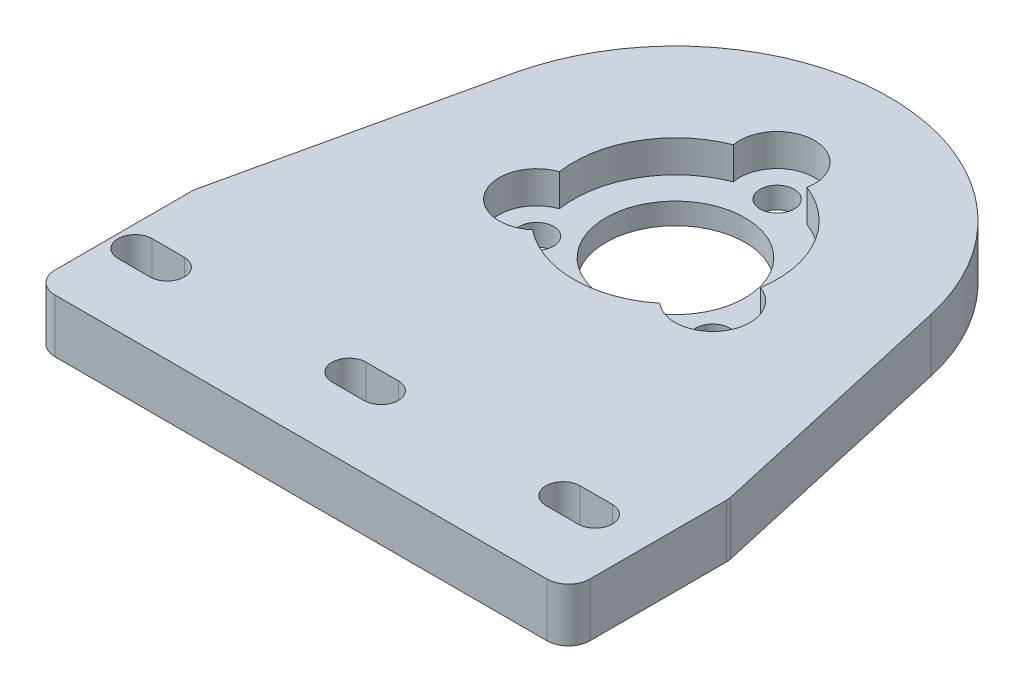
ISO-10303-21;
HEADER;
FILE_DESCRIPTION(('STEP AP214'),'2;1');
FILE_NAME('part.step','',(''),(''),'','','');
FILE_SCHEMA(('AUTOMOTIVE_DESIGN { 1 0 10303 214 1 1 1 1 }'));
ENDSEC;
DATA;
#1=APPLICATION_CONTEXT('core data for automotive mechanical design processes');
#2=APPLICATION_PROTOCOL_DEFINITION('international standard','automotive_design',2000,#1);
#3=PRODUCT_CONTEXT('',#1,'mechanical');
#4=PRODUCT('Part','Part','',(#3));
#5=PRODUCT_RELATED_PRODUCT_CATEGORY('part','',(#4));
#6=PRODUCT_DEFINITION_FORMATION('','',#4);
#7=PRODUCT_DEFINITION_CONTEXT('part definition',#1,'design');
#8=PRODUCT_DEFINITION('design','',#6,#7);
#9=PRODUCT_DEFINITION_SHAPE('','',#8);
#10=(LENGTH_UNIT() NAMED_UNIT(*) SI_UNIT(.MILLI.,.METRE.));
#11=(NAMED_UNIT(*) PLANE_ANGLE_UNIT() SI_UNIT($,.RADIAN.));
#12=(NAMED_UNIT(*) SI_UNIT($,.STERADIAN.) SOLID_ANGLE_UNIT());
#13=UNCERTAINTY_MEASURE_WITH_UNIT(LENGTH_MEASURE(1.E-05),#10,'distance_accuracy_value','');
#14=(GEOMETRIC_REPRESENTATION_CONTEXT(3) GLOBAL_UNCERTAINTY_ASSIGNED_CONTEXT((#13)) GLOBAL_UNIT_ASSIGNED_CONTEXT((#10,
#11,#12)) REPRESENTATION_CONTEXT('',''));
#15=CARTESIAN_POINT('',(0.,0.,0.));
#16=DIRECTION('',(0.,0.,1.));
#17=DIRECTION('',(1.,0.,0.));
#18=AXIS2_PLACEMENT_3D('',#15,#16,#17);
#19=CARTESIAN_POINT('',(0.,5.,0.));
#20=DIRECTION('',(0.,-1.,0.));
#21=DIRECTION('',(0.,0.,-1.));
#22=AXIS2_PLACEMENT_3D('',#19,#20,#21);
#23=CYLINDRICAL_SURFACE('',#22,6.5);
#24=CARTESIAN_POINT('',(0.,0.,0.));
#25=DIRECTION('',(0.,1.,0.));
#26=DIRECTION('',(0.,0.,1.));
#27=AXIS2_PLACEMENT_3D('',#24,#25,#26);
#28=CIRCLE('',#27,6.5);
#29=CARTESIAN_POINT('',(0.,0.,6.5));
#30=VERTEX_POINT('',#29);
#31=EDGE_CURVE('E427',#30,#30,#28,.T.);
#32=ORIENTED_EDGE('',*,*,#31,.F.);
#33=EDGE_LOOP('',(#32));
#34=FACE_BOUND('',#33,.T.);
#35=CARTESIAN_POINT('',(0.,2.,0.));
#36=DIRECTION('',(0.,1.,0.));
#37=DIRECTION('',(0.,0.,1.));
#38=AXIS2_PLACEMENT_3D('',#35,#36,#37);
#39=CIRCLE('',#38,6.5);
#40=CARTESIAN_POINT('',(0.,2.,6.5));
#41=VERTEX_POINT('',#40);
#42=EDGE_CURVE('E377',#41,#41,#39,.F.);
#43=ORIENTED_EDGE('',*,*,#42,.F.);
#44=EDGE_LOOP('',(#43));
#45=FACE_BOUND('',#44,.T.);
#46=ADVANCED_FACE('F82',(#34,#45),#23,.F.);
#47=CARTESIAN_POINT('',(0.,5.,-9.5));
#48=DIRECTION('',(0.,-1.,0.));
#49=DIRECTION('',(0.,0.,-1.));
#50=AXIS2_PLACEMENT_3D('',#47,#48,#49);
#51=CYLINDRICAL_SURFACE('',#50,1.6);
#52=CARTESIAN_POINT('',(0.,0.,-9.5));
#53=DIRECTION('',(0.,1.,0.));
#54=DIRECTION('',(0.,0.,1.));
#55=AXIS2_PLACEMENT_3D('',#52,#53,#54);
#56=CIRCLE('',#55,1.6);
#57=CARTESIAN_POINT('',(0.,0.,-7.9));
#58=VERTEX_POINT('',#57);
#59=EDGE_CURVE('E424',#58,#58,#56,.T.);
#60=ORIENTED_EDGE('',*,*,#59,.F.);
#61=EDGE_LOOP('',(#60));
#62=FACE_BOUND('',#61,.T.);
#63=CARTESIAN_POINT('',(0.,2.,-9.5));
#64=DIRECTION('',(0.,1.,0.));
#65=DIRECTION('',(0.,0.,1.));
#66=AXIS2_PLACEMENT_3D('',#63,#64,#65);
#67=CIRCLE('',#66,1.6);
#68=CARTESIAN_POINT('',(0.,2.,-7.9));
#69=VERTEX_POINT('',#68);
#70=EDGE_CURVE('E398',#69,#69,#67,.T.);
#71=ORIENTED_EDGE('',*,*,#70,.T.);
#72=EDGE_LOOP('',(#71));
#73=FACE_BOUND('',#72,.T.);
#74=ADVANCED_FACE('F565',(#62,#73),#51,.F.);
#75=CARTESIAN_POINT('',(8.22724133595277,5.,4.74999999999965));
#76=DIRECTION('',(0.,-1.,0.));
#77=DIRECTION('',(0.,0.,-1.));
#78=AXIS2_PLACEMENT_3D('',#75,#76,#77);
#79=CYLINDRICAL_SURFACE('',#78,1.60000000000052);
#80=CARTESIAN_POINT('',(8.22724133595277,0.,4.74999999999965));
#81=DIRECTION('',(0.,1.,0.));
#82=DIRECTION('',(0.,0.,1.));
#83=AXIS2_PLACEMENT_3D('',#80,#81,#82);
#84=CIRCLE('',#83,1.60000000000052);
#85=CARTESIAN_POINT('',(8.22724133595277,0.,6.35000000000017));
#86=VERTEX_POINT('',#85);
#87=EDGE_CURVE('E421',#86,#86,#84,.T.);
#88=ORIENTED_EDGE('',*,*,#87,.F.);
#89=EDGE_LOOP('',(#88));
#90=FACE_BOUND('',#89,.T.);
#91=CARTESIAN_POINT('',(8.22724133595277,2.,4.74999999999965));
#92=DIRECTION('',(0.,1.,0.));
#93=DIRECTION('',(0.,0.,1.));
#94=AXIS2_PLACEMENT_3D('',#91,#92,#93);
#95=CIRCLE('',#94,1.60000000000052);
#96=CARTESIAN_POINT('',(8.22724133595277,2.,6.35000000000017));
#97=VERTEX_POINT('',#96);
#98=EDGE_CURVE('E371',#97,#97,#95,.F.);
#99=ORIENTED_EDGE('',*,*,#98,.F.);
#100=EDGE_LOOP('',(#99));
#101=FACE_BOUND('',#100,.T.);
#102=ADVANCED_FACE('F572',(#90,#101),#79,.F.);
#103=CARTESIAN_POINT('',(-8.22724133595156,5.,4.75000000000035));
#104=DIRECTION('',(0.,-1.,0.));
#105=DIRECTION('',(0.,0.,-1.));
#106=AXIS2_PLACEMENT_3D('',#103,#104,#105);
#107=CYLINDRICAL_SURFACE('',#106,1.60000000000076);
#108=CARTESIAN_POINT('',(-8.22724133595156,0.,4.75000000000035));
#109=DIRECTION('',(0.,1.,0.));
#110=DIRECTION('',(0.,0.,1.));
#111=AXIS2_PLACEMENT_3D('',#108,#109,#110);
#112=CIRCLE('',#111,1.60000000000076);
#113=CARTESIAN_POINT('',(-8.22724133595156,0.,6.35000000000111));
#114=VERTEX_POINT('',#113);
#115=EDGE_CURVE('E418',#114,#114,#112,.T.);
#116=ORIENTED_EDGE('',*,*,#115,.F.);
#117=EDGE_LOOP('',(#116));
#118=FACE_BOUND('',#117,.T.);
#119=CARTESIAN_POINT('',(-8.22724133595156,2.,4.75000000000035));
#120=DIRECTION('',(0.,1.,0.));
#121=DIRECTION('',(0.,0.,1.));
#122=AXIS2_PLACEMENT_3D('',#119,#120,#121);
#123=CIRCLE('',#122,1.60000000000076);
#124=CARTESIAN_POINT('',(-8.22724133595156,2.,6.35000000000111));
#125=VERTEX_POINT('',#124);
#126=EDGE_CURVE('E374',#125,#125,#123,.F.);
#127=ORIENTED_EDGE('',*,*,#126,.F.);
#128=EDGE_LOOP('',(#127));
#129=FACE_BOUND('',#128,.T.);
#130=ADVANCED_FACE('F605',(#118,#129),#107,.F.);
#131=CARTESIAN_POINT('',(-25.,0.,20.));
#132=DIRECTION('',(-1.,0.,0.));
#133=DIRECTION('',(0.,0.,1.));
#134=AXIS2_PLACEMENT_3D('',#131,#132,#133);
#135=PLANE('',#134);
#136=DIRECTION('',(0.,0.,1.));
#137=VECTOR('',#136,1.);
#138=CARTESIAN_POINT('',(-25.,5.,20.));
#139=LINE('',#138,#137);
#140=CARTESIAN_POINT('',(-25.,5.,20.2222222222222));
#141=VERTEX_POINT('',#140);
#142=CARTESIAN_POINT('',(-25.,5.,33.));
#143=VERTEX_POINT('',#142);
#144=EDGE_CURVE('E457',#141,#143,#139,.T.);
#145=ORIENTED_EDGE('',*,*,#144,.F.);
#146=DIRECTION('',(0.,1.,0.));
#147=VECTOR('',#146,1.);
#148=CARTESIAN_POINT('',(-25.,0.,20.2222222222222));
#149=LINE('',#148,#147);
#150=CARTESIAN_POINT('',(-25.,0.,20.2222222222222));
#151=VERTEX_POINT('',#150);
#152=EDGE_CURVE('E491',#141,#151,#149,.F.);
#153=ORIENTED_EDGE('',*,*,#152,.T.);
#154=DIRECTION('',(0.,0.,1.));
#155=VECTOR('',#154,1.);
#156=CARTESIAN_POINT('',(-25.,0.,20.));
#157=LINE('',#156,#155);
#158=CARTESIAN_POINT('',(-25.,0.,33.));
#159=VERTEX_POINT('',#158);
#160=EDGE_CURVE('E460',#151,#159,#157,.T.);
#161=ORIENTED_EDGE('',*,*,#160,.T.);
#162=DIRECTION('',(0.,1.,0.));
#163=VECTOR('',#162,1.);
#164=CARTESIAN_POINT('',(-25.,0.,33.));
#165=LINE('',#164,#163);
#166=EDGE_CURVE('E488',#159,#143,#165,.T.);
#167=ORIENTED_EDGE('',*,*,#166,.T.);
#168=EDGE_LOOP('',(#145,#153,#161,#167));
#169=FACE_BOUND('',#168,.T.);
#170=ADVANCED_FACE('F537',(#169),#135,.T.);
#171=CARTESIAN_POINT('',(25.,0.,20.));
#172=DIRECTION('',(1.,0.,0.));
#173=DIRECTION('',(0.,0.,-1.));
#174=AXIS2_PLACEMENT_3D('',#171,#172,#173);
#175=PLANE('',#174);
#176=DIRECTION('',(0.,0.,-1.));
#177=VECTOR('',#176,1.);
#178=CARTESIAN_POINT('',(25.,0.,20.));
#179=LINE('',#178,#177);
#180=CARTESIAN_POINT('',(25.,0.,33.));
#181=VERTEX_POINT('',#180);
#182=CARTESIAN_POINT('',(25.,0.,20.2222222222222));
#183=VERTEX_POINT('',#182);
#184=EDGE_CURVE('E467',#181,#183,#179,.T.);
#185=ORIENTED_EDGE('',*,*,#184,.T.);
#186=DIRECTION('',(0.,1.,0.));
#187=VECTOR('',#186,1.);
#188=CARTESIAN_POINT('',(25.,0.,20.2222222222222));
#189=LINE('',#188,#187);
#190=CARTESIAN_POINT('',(25.,5.,20.2222222222222));
#191=VERTEX_POINT('',#190);
#192=EDGE_CURVE('E90',#183,#191,#189,.T.);
#193=ORIENTED_EDGE('',*,*,#192,.T.);
#194=DIRECTION('',(0.,0.,-1.));
#195=VECTOR('',#194,1.);
#196=CARTESIAN_POINT('',(25.,5.,20.));
#197=LINE('',#196,#195);
#198=CARTESIAN_POINT('',(25.,5.,33.));
#199=VERTEX_POINT('',#198);
#200=EDGE_CURVE('E464',#199,#191,#197,.T.);
#201=ORIENTED_EDGE('',*,*,#200,.F.);
#202=DIRECTION('',(0.,1.,0.));
#203=VECTOR('',#202,1.);
#204=CARTESIAN_POINT('',(25.,0.,33.));
#205=LINE('',#204,#203);
#206=EDGE_CURVE('E506',#199,#181,#205,.F.);
#207=ORIENTED_EDGE('',*,*,#206,.T.);
#208=EDGE_LOOP('',(#185,#193,#201,#207));
#209=FACE_BOUND('',#208,.T.);
#210=ADVANCED_FACE('F511',(#209),#175,.T.);
#211=CARTESIAN_POINT('',(-25.,0.,35.));
#212=DIRECTION('',(0.,0.,1.));
#213=DIRECTION('',(1.,0.,0.));
#214=AXIS2_PLACEMENT_3D('',#211,#212,#213);
#215=PLANE('',#214);
#216=DIRECTION('',(1.,0.,0.));
#217=VECTOR('',#216,1.);
#218=CARTESIAN_POINT('',(-25.,5.,35.));
#219=LINE('',#218,#217);
#220=CARTESIAN_POINT('',(-23.,5.,35.));
#221=VERTEX_POINT('',#220);
#222=CARTESIAN_POINT('',(23.,5.,35.));
#223=VERTEX_POINT('',#222);
#224=EDGE_CURVE('E473',#221,#223,#219,.T.);
#225=ORIENTED_EDGE('',*,*,#224,.F.);
#226=DIRECTION('',(0.,1.,0.));
#227=VECTOR('',#226,1.);
#228=CARTESIAN_POINT('',(-23.,0.,35.));
#229=LINE('',#228,#227);
#230=CARTESIAN_POINT('',(-23.,0.,35.));
#231=VERTEX_POINT('',#230);
#232=EDGE_CURVE('E504',#221,#231,#229,.F.);
#233=ORIENTED_EDGE('',*,*,#232,.T.);
#234=DIRECTION('',(1.,0.,0.));
#235=VECTOR('',#234,1.);
#236=CARTESIAN_POINT('',(-25.,0.,35.));
#237=LINE('',#236,#235);
#238=CARTESIAN_POINT('',(23.,0.,35.));
#239=VERTEX_POINT('',#238);
#240=EDGE_CURVE('E463',#231,#239,#237,.T.);
#241=ORIENTED_EDGE('',*,*,#240,.T.);
#242=DIRECTION('',(0.,1.,0.));
#243=VECTOR('',#242,1.);
#244=CARTESIAN_POINT('',(23.,0.,35.));
#245=LINE('',#244,#243);
#246=EDGE_CURVE('E501',#239,#223,#245,.T.);
#247=ORIENTED_EDGE('',*,*,#246,.T.);
#248=EDGE_LOOP('',(#225,#233,#241,#247));
#249=FACE_BOUND('',#248,.T.);
#250=ADVANCED_FACE('F524',(#249),#215,.T.);
#251=CARTESIAN_POINT('',(0.,0.,0.));
#252=DIRECTION('',(0.,1.,0.));
#253=DIRECTION('',(0.,0.,1.));
#254=AXIS2_PLACEMENT_3D('',#251,#252,#253);
#255=PLANE('',#254);
#256=CARTESIAN_POINT('',(0.,0.,27.5));
#257=DIRECTION('',(0.,1.,0.));
#258=DIRECTION('',(0.,0.,1.));
#259=AXIS2_PLACEMENT_3D('',#256,#257,#258);
#260=CIRCLE('',#259,1.6);
#261=CARTESIAN_POINT('',(0.,0.,29.1));
#262=VERTEX_POINT('',#261);
#263=CARTESIAN_POINT('',(0.,0.,25.9));
#264=VERTEX_POINT('',#263);
#265=EDGE_CURVE('E444',#262,#264,#260,.T.);
#266=ORIENTED_EDGE('',*,*,#265,.T.);
#267=DIRECTION('',(1.,0.,0.));
#268=VECTOR('',#267,1.);
#269=CARTESIAN_POINT('',(0.,0.,25.9));
#270=LINE('',#269,#268);
#271=CARTESIAN_POINT('',(-3.,0.,25.9));
#272=VERTEX_POINT('',#271);
#273=EDGE_CURVE('E314',#272,#264,#270,.T.);
#274=ORIENTED_EDGE('',*,*,#273,.F.);
#275=CARTESIAN_POINT('',(-3.,0.,27.5));
#276=DIRECTION('',(0.,-1.,0.));
#277=DIRECTION('',(0.,0.,-1.));
#278=AXIS2_PLACEMENT_3D('',#275,#276,#277);
#279=CIRCLE('',#278,1.6);
#280=CARTESIAN_POINT('',(-3.,0.,29.1));
#281=VERTEX_POINT('',#280);
#282=EDGE_CURVE('E316',#281,#272,#279,.T.);
#283=ORIENTED_EDGE('',*,*,#282,.F.);
#284=DIRECTION('',(-1.,0.,0.));
#285=VECTOR('',#284,1.);
#286=CARTESIAN_POINT('',(0.,0.,29.1));
#287=LINE('',#286,#285);
#288=EDGE_CURVE('E295',#262,#281,#287,.T.);
#289=ORIENTED_EDGE('',*,*,#288,.F.);
#290=EDGE_LOOP('',(#266,#274,#283,#289));
#291=FACE_BOUND('',#290,.T.);
#292=CARTESIAN_POINT('',(20.,0.,27.5));
#293=DIRECTION('',(0.,1.,0.));
#294=DIRECTION('',(0.,0.,1.));
#295=AXIS2_PLACEMENT_3D('',#292,#293,#294);
#296=CIRCLE('',#295,1.6);
#297=CARTESIAN_POINT('',(20.,0.,29.1));
#298=VERTEX_POINT('',#297);
#299=CARTESIAN_POINT('',(20.,0.,25.9));
#300=VERTEX_POINT('',#299);
#301=EDGE_CURVE('E449',#298,#300,#296,.T.);
#302=ORIENTED_EDGE('',*,*,#301,.T.);
#303=DIRECTION('',(1.,0.,0.));
#304=VECTOR('',#303,1.);
#305=CARTESIAN_POINT('',(20.,0.,25.9));
#306=LINE('',#305,#304);
#307=CARTESIAN_POINT('',(17.,0.,25.9));
#308=VERTEX_POINT('',#307);
#309=EDGE_CURVE('E288',#308,#300,#306,.T.);
#310=ORIENTED_EDGE('',*,*,#309,.F.);
#311=CARTESIAN_POINT('',(17.,0.,27.5));
#312=DIRECTION('',(0.,-1.,0.));
#313=DIRECTION('',(0.,0.,-1.));
#314=AXIS2_PLACEMENT_3D('',#311,#312,#313);
#315=CIRCLE('',#314,1.6);
#316=CARTESIAN_POINT('',(17.,0.,29.1));
#317=VERTEX_POINT('',#316);
#318=EDGE_CURVE('E290',#317,#308,#315,.T.);
#319=ORIENTED_EDGE('',*,*,#318,.F.);
#320=DIRECTION('',(-1.,0.,0.));
#321=VECTOR('',#320,1.);
#322=CARTESIAN_POINT('',(20.,0.,29.1));
#323=LINE('',#322,#321);
#324=EDGE_CURVE('E268',#298,#317,#323,.T.);
#325=ORIENTED_EDGE('',*,*,#324,.F.);
#326=EDGE_LOOP('',(#302,#310,#319,#325));
#327=FACE_BOUND('',#326,.T.);
#328=CARTESIAN_POINT('',(-20.,0.,27.5));
#329=DIRECTION('',(0.,1.,0.));
#330=DIRECTION('',(0.,0.,1.));
#331=AXIS2_PLACEMENT_3D('',#328,#329,#330);
#332=CIRCLE('',#331,1.6);
#333=CARTESIAN_POINT('',(-20.,0.,29.1));
#334=VERTEX_POINT('',#333);
#335=CARTESIAN_POINT('',(-20.,0.,25.9));
#336=VERTEX_POINT('',#335);
#337=EDGE_CURVE('E454',#334,#336,#332,.T.);
#338=ORIENTED_EDGE('',*,*,#337,.T.);
#339=DIRECTION('',(1.,0.,0.));
#340=VECTOR('',#339,1.);
#341=CARTESIAN_POINT('',(-20.,0.,25.9));
#342=LINE('',#341,#340);
#343=CARTESIAN_POINT('',(-23.,0.,25.9));
#344=VERTEX_POINT('',#343);
#345=EDGE_CURVE('E339',#344,#336,#342,.T.);
#346=ORIENTED_EDGE('',*,*,#345,.F.);
#347=CARTESIAN_POINT('',(-23.,0.,27.5));
#348=DIRECTION('',(0.,-1.,0.));
#349=DIRECTION('',(0.,0.,-1.));
#350=AXIS2_PLACEMENT_3D('',#347,#348,#349);
#351=CIRCLE('',#350,1.6);
#352=CARTESIAN_POINT('',(-23.,0.,29.1));
#353=VERTEX_POINT('',#352);
#354=EDGE_CURVE('E341',#353,#344,#351,.T.);
#355=ORIENTED_EDGE('',*,*,#354,.F.);
#356=DIRECTION('',(-1.,0.,0.));
#357=VECTOR('',#356,1.);
#358=CARTESIAN_POINT('',(-20.,0.,29.1));
#359=LINE('',#358,#357);
#360=EDGE_CURVE('E313',#334,#353,#359,.T.);
#361=ORIENTED_EDGE('',*,*,#360,.F.);
#362=EDGE_LOOP('',(#338,#346,#355,#361));
#363=FACE_BOUND('',#362,.T.);
#364=ORIENTED_EDGE('',*,*,#160,.F.);
#365=CARTESIAN_POINT('',(-23.,0.,20.2222222222222));
#366=DIRECTION('',(0.,1.,0.));
#367=DIRECTION('',(0.,0.,1.));
#368=AXIS2_PLACEMENT_3D('',#365,#366,#367);
#369=CIRCLE('',#368,2.);
#370=CARTESIAN_POINT('',(-24.9512195121951,0.,19.7831978319783));
#371=VERTEX_POINT('',#370);
#372=EDGE_CURVE('E499',#151,#371,#369,.F.);
#373=ORIENTED_EDGE('',*,*,#372,.T.);
#374=DIRECTION('',(0.219512195121951,0.,-0.975609756097561));
#375=VECTOR('',#374,1.);
#376=CARTESIAN_POINT('',(-19.5121951219512,0.,-4.39024390243902));
#377=LINE('',#376,#375);
#378=CARTESIAN_POINT('',(-19.5121951219512,0.,-4.39024390243902));
#379=VERTEX_POINT('',#378);
#380=EDGE_CURVE('E437',#371,#379,#377,.T.);
#381=ORIENTED_EDGE('',*,*,#380,.T.);
#382=CARTESIAN_POINT('',(0.,0.,0.));
#383=DIRECTION('',(0.,1.,0.));
#384=DIRECTION('',(0.,0.,1.));
#385=AXIS2_PLACEMENT_3D('',#382,#383,#384);
#386=CIRCLE('',#385,20.);
#387=CARTESIAN_POINT('',(19.5121951219512,0.,-4.39024390243903));
#388=VERTEX_POINT('',#387);
#389=EDGE_CURVE('E430',#388,#379,#386,.T.);
#390=ORIENTED_EDGE('',*,*,#389,.F.);
#391=DIRECTION('',(-0.219512195121952,0.,-0.975609756097561));
#392=VECTOR('',#391,1.);
#393=CARTESIAN_POINT('',(19.5121951219512,0.,-4.39024390243903));
#394=LINE('',#393,#392);
#395=CARTESIAN_POINT('',(24.9512195121951,0.,19.7831978319783));
#396=VERTEX_POINT('',#395);
#397=EDGE_CURVE('E412',#396,#388,#394,.T.);
#398=ORIENTED_EDGE('',*,*,#397,.F.);
#399=CARTESIAN_POINT('',(23.,0.,20.2222222222222));
#400=DIRECTION('',(0.,1.,0.));
#401=DIRECTION('',(0.,0.,1.));
#402=AXIS2_PLACEMENT_3D('',#399,#400,#401);
#403=CIRCLE('',#402,2.);
#404=EDGE_CURVE('E495',#396,#183,#403,.F.);
#405=ORIENTED_EDGE('',*,*,#404,.T.);
#406=ORIENTED_EDGE('',*,*,#184,.F.);
#407=CARTESIAN_POINT('',(23.,0.,33.));
#408=DIRECTION('',(0.,1.,0.));
#409=DIRECTION('',(0.,0.,1.));
#410=AXIS2_PLACEMENT_3D('',#407,#408,#409);
#411=CIRCLE('',#410,2.);
#412=EDGE_CURVE('E493',#181,#239,#411,.F.);
#413=ORIENTED_EDGE('',*,*,#412,.T.);
#414=ORIENTED_EDGE('',*,*,#240,.F.);
#415=CARTESIAN_POINT('',(-23.,0.,33.));
#416=DIRECTION('',(0.,1.,0.));
#417=DIRECTION('',(0.,0.,1.));
#418=AXIS2_PLACEMENT_3D('',#415,#416,#417);
#419=CIRCLE('',#418,2.);
#420=EDGE_CURVE('E497',#231,#159,#419,.F.);
#421=ORIENTED_EDGE('',*,*,#420,.T.);
#422=EDGE_LOOP('',(#364,#373,#381,#390,#398,#405,#406,#413,#414,#421));
#423=FACE_BOUND('',#422,.T.);
#424=ORIENTED_EDGE('',*,*,#31,.T.);
#425=EDGE_LOOP('',(#424));
#426=FACE_BOUND('',#425,.T.);
#427=ORIENTED_EDGE('',*,*,#59,.T.);
#428=EDGE_LOOP('',(#427));
#429=FACE_BOUND('',#428,.T.);
#430=ORIENTED_EDGE('',*,*,#87,.T.);
#431=EDGE_LOOP('',(#430));
#432=FACE_BOUND('',#431,.T.);
#433=ORIENTED_EDGE('',*,*,#115,.T.);
#434=EDGE_LOOP('',(#433));
#435=FACE_BOUND('',#434,.T.);
#436=ADVANCED_FACE('F530',(#291,#327,#363,#423,#426,#429,#432,#435),#255,.F.);
#437=CARTESIAN_POINT('',(0.,5.,0.));
#438=DIRECTION('',(0.,1.,0.));
#439=DIRECTION('',(0.,0.,1.));
#440=AXIS2_PLACEMENT_3D('',#437,#438,#439);
#441=PLANE('',#440);
#442=DIRECTION('',(1.,0.,0.));
#443=VECTOR('',#442,1.);
#444=CARTESIAN_POINT('',(20.,5.,25.9));
#445=LINE('',#444,#443);
#446=CARTESIAN_POINT('',(17.,5.,25.9));
#447=VERTEX_POINT('',#446);
#448=CARTESIAN_POINT('',(20.,5.,25.9));
#449=VERTEX_POINT('',#448);
#450=EDGE_CURVE('E281',#447,#449,#445,.T.);
#451=ORIENTED_EDGE('',*,*,#450,.T.);
#452=CARTESIAN_POINT('',(20.,5.,27.5));
#453=DIRECTION('',(0.,1.,0.));
#454=DIRECTION('',(0.,0.,1.));
#455=AXIS2_PLACEMENT_3D('',#452,#453,#454);
#456=CIRCLE('',#455,1.6);
#457=CARTESIAN_POINT('',(20.,5.,29.1));
#458=VERTEX_POINT('',#457);
#459=EDGE_CURVE('E287',#458,#449,#456,.T.);
#460=ORIENTED_EDGE('',*,*,#459,.F.);
#461=DIRECTION('',(-1.,0.,0.));
#462=VECTOR('',#461,1.);
#463=CARTESIAN_POINT('',(20.,5.,29.1));
#464=LINE('',#463,#462);
#465=CARTESIAN_POINT('',(17.,5.,29.1));
#466=VERTEX_POINT('',#465);
#467=EDGE_CURVE('E105',#458,#466,#464,.T.);
#468=ORIENTED_EDGE('',*,*,#467,.T.);
#469=CARTESIAN_POINT('',(17.,5.,27.5));
#470=DIRECTION('',(0.,-1.,0.));
#471=DIRECTION('',(0.,0.,-1.));
#472=AXIS2_PLACEMENT_3D('',#469,#470,#471);
#473=CIRCLE('',#472,1.6);
#474=EDGE_CURVE('E276',#466,#447,#473,.T.);
#475=ORIENTED_EDGE('',*,*,#474,.T.);
#476=EDGE_LOOP('',(#451,#460,#468,#475));
#477=FACE_BOUND('',#476,.T.);
#478=DIRECTION('',(1.,0.,0.));
#479=VECTOR('',#478,1.);
#480=CARTESIAN_POINT('',(0.,5.,25.9));
#481=LINE('',#480,#479);
#482=CARTESIAN_POINT('',(-3.,5.,25.9));
#483=VERTEX_POINT('',#482);
#484=CARTESIAN_POINT('',(0.,5.,25.9));
#485=VERTEX_POINT('',#484);
#486=EDGE_CURVE('E305',#483,#485,#481,.T.);
#487=ORIENTED_EDGE('',*,*,#486,.T.);
#488=CARTESIAN_POINT('',(0.,5.,27.5));
#489=DIRECTION('',(0.,1.,0.));
#490=DIRECTION('',(0.,0.,1.));
#491=AXIS2_PLACEMENT_3D('',#488,#489,#490);
#492=CIRCLE('',#491,1.6);
#493=CARTESIAN_POINT('',(0.,5.,29.1));
#494=VERTEX_POINT('',#493);
#495=EDGE_CURVE('E443',#494,#485,#492,.T.);
#496=ORIENTED_EDGE('',*,*,#495,.F.);
#497=DIRECTION('',(-1.,0.,0.));
#498=VECTOR('',#497,1.);
#499=CARTESIAN_POINT('',(0.,5.,29.1));
#500=LINE('',#499,#498);
#501=CARTESIAN_POINT('',(-3.,5.,29.1));
#502=VERTEX_POINT('',#501);
#503=EDGE_CURVE('E317',#494,#502,#500,.T.);
#504=ORIENTED_EDGE('',*,*,#503,.T.);
#505=CARTESIAN_POINT('',(-3.,5.,27.5));
#506=DIRECTION('',(0.,-1.,0.));
#507=DIRECTION('',(0.,0.,-1.));
#508=AXIS2_PLACEMENT_3D('',#505,#506,#507);
#509=CIRCLE('',#508,1.6);
#510=EDGE_CURVE('E324',#502,#483,#509,.T.);
#511=ORIENTED_EDGE('',*,*,#510,.T.);
#512=EDGE_LOOP('',(#487,#496,#504,#511));
#513=FACE_BOUND('',#512,.T.);
#514=DIRECTION('',(1.,0.,0.));
#515=VECTOR('',#514,1.);
#516=CARTESIAN_POINT('',(-20.,5.,25.9));
#517=LINE('',#516,#515);
#518=CARTESIAN_POINT('',(-23.,5.,25.9));
#519=VERTEX_POINT('',#518);
#520=CARTESIAN_POINT('',(-20.,5.,25.9));
#521=VERTEX_POINT('',#520);
#522=EDGE_CURVE('E331',#519,#521,#517,.T.);
#523=ORIENTED_EDGE('',*,*,#522,.T.);
#524=CARTESIAN_POINT('',(-20.,5.,27.5));
#525=DIRECTION('',(0.,1.,0.));
#526=DIRECTION('',(0.,0.,1.));
#527=AXIS2_PLACEMENT_3D('',#524,#525,#526);
#528=CIRCLE('',#527,1.6);
#529=CARTESIAN_POINT('',(-20.,5.,29.1));
#530=VERTEX_POINT('',#529);
#531=EDGE_CURVE('E452',#530,#521,#528,.T.);
#532=ORIENTED_EDGE('',*,*,#531,.F.);
#533=DIRECTION('',(-1.,0.,0.));
#534=VECTOR('',#533,1.);
#535=CARTESIAN_POINT('',(-20.,5.,29.1));
#536=LINE('',#535,#534);
#537=CARTESIAN_POINT('',(-23.,5.,29.1));
#538=VERTEX_POINT('',#537);
#539=EDGE_CURVE('E97',#530,#538,#536,.T.);
#540=ORIENTED_EDGE('',*,*,#539,.T.);
#541=CARTESIAN_POINT('',(-23.,5.,27.5));
#542=DIRECTION('',(0.,-1.,0.));
#543=DIRECTION('',(0.,0.,-1.));
#544=AXIS2_PLACEMENT_3D('',#541,#542,#543);
#545=CIRCLE('',#544,1.6);
#546=EDGE_CURVE('E348',#538,#519,#545,.T.);
#547=ORIENTED_EDGE('',*,*,#546,.T.);
#548=EDGE_LOOP('',(#523,#532,#540,#547));
#549=FACE_BOUND('',#548,.T.);
#550=CARTESIAN_POINT('',(0.,5.,-9.5));
#551=DIRECTION('',(0.,1.,0.));
#552=DIRECTION('',(0.,0.,1.));
#553=AXIS2_PLACEMENT_3D('',#550,#551,#552);
#554=CIRCLE('',#553,3.5);
#555=CARTESIAN_POINT('',(3.44010383628643,5.,-8.85526315789508));
#556=VERTEX_POINT('',#555);
#557=CARTESIAN_POINT('',(-3.44010383628643,5.,-8.85526315789508));
#558=VERTEX_POINT('',#557);
#559=EDGE_CURVE('E383',#556,#558,#554,.T.);
#560=ORIENTED_EDGE('',*,*,#559,.F.);
#561=CARTESIAN_POINT('',(0.,5.,0.));
#562=DIRECTION('',(0.,1.,0.));
#563=DIRECTION('',(0.,0.,1.));
#564=AXIS2_PLACEMENT_3D('',#561,#562,#563);
#565=CIRCLE('',#564,9.50000000000035);
#566=CARTESIAN_POINT('',(9.38893477007685,5.,1.44841426506666));
#567=VERTEX_POINT('',#566);
#568=EDGE_CURVE('E300',#567,#556,#565,.T.);
#569=ORIENTED_EDGE('',*,*,#568,.F.);
#570=CARTESIAN_POINT('',(8.22724133595277,5.,4.74999999999965));
#571=DIRECTION('',(0.,1.,0.));
#572=DIRECTION('',(0.,0.,1.));
#573=AXIS2_PLACEMENT_3D('',#570,#571,#572);
#574=CIRCLE('',#573,3.5);
#575=CARTESIAN_POINT('',(5.94883093379086,5.,7.40684889282747));
#576=VERTEX_POINT('',#575);
#577=EDGE_CURVE('E356',#576,#567,#574,.T.);
#578=ORIENTED_EDGE('',*,*,#577,.F.);
#579=CARTESIAN_POINT('',(0.,5.,0.));
#580=DIRECTION('',(0.,1.,0.));
#581=DIRECTION('',(0.,0.,1.));
#582=AXIS2_PLACEMENT_3D('',#579,#580,#581);
#583=CIRCLE('',#582,9.50000000000035);
#584=CARTESIAN_POINT('',(-5.94883093378982,5.,7.40684889282831));
#585=VERTEX_POINT('',#584);
#586=EDGE_CURVE('E391',#585,#576,#583,.T.);
#587=ORIENTED_EDGE('',*,*,#586,.F.);
#588=CARTESIAN_POINT('',(-8.22724133595156,5.,4.75000000000035));
#589=DIRECTION('',(0.,1.,0.));
#590=DIRECTION('',(0.,0.,1.));
#591=AXIS2_PLACEMENT_3D('',#588,#589,#590);
#592=CIRCLE('',#591,3.5);
#593=CARTESIAN_POINT('',(-9.38893477007668,5.,1.44841426506772));
#594=VERTEX_POINT('',#593);
#595=EDGE_CURVE('E388',#594,#585,#592,.T.);
#596=ORIENTED_EDGE('',*,*,#595,.F.);
#597=CARTESIAN_POINT('',(0.,5.,0.));
#598=DIRECTION('',(0.,1.,0.));
#599=DIRECTION('',(0.,0.,1.));
#600=AXIS2_PLACEMENT_3D('',#597,#598,#599);
#601=CIRCLE('',#600,9.50000000000035);
#602=EDGE_CURVE('E385',#558,#594,#601,.T.);
#603=ORIENTED_EDGE('',*,*,#602,.F.);
#604=EDGE_LOOP('',(#560,#569,#578,#587,#596,#603));
#605=FACE_BOUND('',#604,.T.);
#606=DIRECTION('',(0.219512195121951,0.,-0.975609756097561));
#607=VECTOR('',#606,1.);
#608=CARTESIAN_POINT('',(-19.5121951219512,5.,-4.39024390243902));
#609=LINE('',#608,#607);
#610=CARTESIAN_POINT('',(-24.9512195121951,5.,19.7831978319783));
#611=VERTEX_POINT('',#610);
#612=CARTESIAN_POINT('',(-19.5121951219512,5.,-4.39024390243902));
#613=VERTEX_POINT('',#612);
#614=EDGE_CURVE('E434',#611,#613,#609,.T.);
#615=ORIENTED_EDGE('',*,*,#614,.F.);
#616=CARTESIAN_POINT('',(-23.,5.,20.2222222222222));
#617=DIRECTION('',(0.,1.,0.));
#618=DIRECTION('',(0.,0.,1.));
#619=AXIS2_PLACEMENT_3D('',#616,#617,#618);
#620=CIRCLE('',#619,2.);
#621=EDGE_CURVE('E486',#611,#141,#620,.T.);
#622=ORIENTED_EDGE('',*,*,#621,.T.);
#623=ORIENTED_EDGE('',*,*,#144,.T.);
#624=CARTESIAN_POINT('',(-23.,5.,33.));
#625=DIRECTION('',(0.,1.,0.));
#626=DIRECTION('',(0.,0.,1.));
#627=AXIS2_PLACEMENT_3D('',#624,#625,#626);
#628=CIRCLE('',#627,2.);
#629=EDGE_CURVE('E484',#143,#221,#628,.T.);
#630=ORIENTED_EDGE('',*,*,#629,.T.);
#631=ORIENTED_EDGE('',*,*,#224,.T.);
#632=CARTESIAN_POINT('',(23.,5.,33.));
#633=DIRECTION('',(0.,1.,0.));
#634=DIRECTION('',(0.,0.,1.));
#635=AXIS2_PLACEMENT_3D('',#632,#633,#634);
#636=CIRCLE('',#635,2.);
#637=EDGE_CURVE('E480',#223,#199,#636,.T.);
#638=ORIENTED_EDGE('',*,*,#637,.T.);
#639=ORIENTED_EDGE('',*,*,#200,.T.);
#640=CARTESIAN_POINT('',(23.,5.,20.2222222222222));
#641=DIRECTION('',(0.,1.,0.));
#642=DIRECTION('',(0.,0.,1.));
#643=AXIS2_PLACEMENT_3D('',#640,#641,#642);
#644=CIRCLE('',#643,2.);
#645=CARTESIAN_POINT('',(24.9512195121951,5.,19.7831978319783));
#646=VERTEX_POINT('',#645);
#647=EDGE_CURVE('E482',#191,#646,#644,.T.);
#648=ORIENTED_EDGE('',*,*,#647,.T.);
#649=DIRECTION('',(-0.219512195121952,0.,-0.975609756097561));
#650=VECTOR('',#649,1.);
#651=CARTESIAN_POINT('',(19.5121951219512,5.,-4.39024390243903));
#652=LINE('',#651,#650);
#653=CARTESIAN_POINT('',(19.5121951219512,5.,-4.39024390243903));
#654=VERTEX_POINT('',#653);
#655=EDGE_CURVE('E411',#646,#654,#652,.T.);
#656=ORIENTED_EDGE('',*,*,#655,.T.);
#657=CARTESIAN_POINT('',(0.,5.,0.));
#658=DIRECTION('',(0.,1.,0.));
#659=DIRECTION('',(0.,0.,1.));
#660=AXIS2_PLACEMENT_3D('',#657,#658,#659);
#661=CIRCLE('',#660,20.);
#662=EDGE_CURVE('E431',#654,#613,#661,.T.);
#663=ORIENTED_EDGE('',*,*,#662,.T.);
#664=EDGE_LOOP('',(#615,#622,#623,#630,#631,#638,#639,#648,#656,#663));
#665=FACE_BOUND('',#664,.T.);
#666=ADVANCED_FACE('F284',(#477,#513,#549,#605,#665),#441,.T.);
#667=CARTESIAN_POINT('',(-20.,0.,27.5));
#668=DIRECTION('',(0.,1.,0.));
#669=DIRECTION('',(0.,0.,1.));
#670=AXIS2_PLACEMENT_3D('',#667,#668,#669);
#671=CYLINDRICAL_SURFACE('',#670,1.6);
#672=ORIENTED_EDGE('',*,*,#531,.T.);
#673=DIRECTION('',(0.,-1.,0.));
#674=VECTOR('',#673,1.);
#675=CARTESIAN_POINT('',(-20.,5.,25.9));
#676=LINE('',#675,#674);
#677=EDGE_CURVE('E336',#521,#336,#676,.T.);
#678=ORIENTED_EDGE('',*,*,#677,.T.);
#679=ORIENTED_EDGE('',*,*,#337,.F.);
#680=DIRECTION('',(0.,-1.,0.));
#681=VECTOR('',#680,1.);
#682=CARTESIAN_POINT('',(-20.,5.,29.1));
#683=LINE('',#682,#681);
#684=EDGE_CURVE('E329',#530,#334,#683,.T.);
#685=ORIENTED_EDGE('',*,*,#684,.F.);
#686=EDGE_LOOP('',(#672,#678,#679,#685));
#687=FACE_BOUND('',#686,.T.);
#688=ADVANCED_FACE('F589',(#687),#671,.F.);
#689=CARTESIAN_POINT('',(20.,0.,27.5));
#690=DIRECTION('',(0.,1.,0.));
#691=DIRECTION('',(0.,0.,1.));
#692=AXIS2_PLACEMENT_3D('',#689,#690,#691);
#693=CYLINDRICAL_SURFACE('',#692,1.6);
#694=ORIENTED_EDGE('',*,*,#459,.T.);
#695=DIRECTION('',(0.,-1.,0.));
#696=VECTOR('',#695,1.);
#697=CARTESIAN_POINT('',(20.,5.,25.9));
#698=LINE('',#697,#696);
#699=EDGE_CURVE('E297',#449,#300,#698,.T.);
#700=ORIENTED_EDGE('',*,*,#699,.T.);
#701=ORIENTED_EDGE('',*,*,#301,.F.);
#702=DIRECTION('',(0.,-1.,0.));
#703=VECTOR('',#702,1.);
#704=CARTESIAN_POINT('',(20.,5.,29.1));
#705=LINE('',#704,#703);
#706=EDGE_CURVE('E273',#458,#298,#705,.T.);
#707=ORIENTED_EDGE('',*,*,#706,.F.);
#708=EDGE_LOOP('',(#694,#700,#701,#707));
#709=FACE_BOUND('',#708,.T.);
#710=ADVANCED_FACE('F585',(#709),#693,.F.);
#711=CARTESIAN_POINT('',(0.,0.,27.5));
#712=DIRECTION('',(0.,1.,0.));
#713=DIRECTION('',(0.,0.,1.));
#714=AXIS2_PLACEMENT_3D('',#711,#712,#713);
#715=CYLINDRICAL_SURFACE('',#714,1.6);
#716=ORIENTED_EDGE('',*,*,#495,.T.);
#717=DIRECTION('',(0.,-1.,0.));
#718=VECTOR('',#717,1.);
#719=CARTESIAN_POINT('',(0.,5.,25.9));
#720=LINE('',#719,#718);
#721=EDGE_CURVE('E310',#485,#264,#720,.T.);
#722=ORIENTED_EDGE('',*,*,#721,.T.);
#723=ORIENTED_EDGE('',*,*,#265,.F.);
#724=DIRECTION('',(0.,-1.,0.));
#725=VECTOR('',#724,1.);
#726=CARTESIAN_POINT('',(0.,5.,29.1));
#727=LINE('',#726,#725);
#728=EDGE_CURVE('E303',#494,#262,#727,.T.);
#729=ORIENTED_EDGE('',*,*,#728,.F.);
#730=EDGE_LOOP('',(#716,#722,#723,#729));
#731=FACE_BOUND('',#730,.T.);
#732=ADVANCED_FACE('F582',(#731),#715,.F.);
#733=CARTESIAN_POINT('',(-19.5121951219512,0.,-4.39024390243902));
#734=DIRECTION('',(0.975609756097561,0.,0.219512195121951));
#735=DIRECTION('',(0.219512195121951,0.,-0.975609756097561));
#736=AXIS2_PLACEMENT_3D('',#733,#734,#735);
#737=PLANE('',#736);
#738=ORIENTED_EDGE('',*,*,#380,.F.);
#739=DIRECTION('',(0.,1.,0.));
#740=VECTOR('',#739,1.);
#741=CARTESIAN_POINT('',(-24.9512195121951,5.,19.7831978319783));
#742=LINE('',#741,#740);
#743=EDGE_CURVE('E470',#371,#611,#742,.T.);
#744=ORIENTED_EDGE('',*,*,#743,.T.);
#745=ORIENTED_EDGE('',*,*,#614,.T.);
#746=DIRECTION('',(0.,1.,0.));
#747=VECTOR('',#746,1.);
#748=CARTESIAN_POINT('',(-19.5121951219512,0.,-4.39024390243902));
#749=LINE('',#748,#747);
#750=EDGE_CURVE('E439',#379,#613,#749,.T.);
#751=ORIENTED_EDGE('',*,*,#750,.F.);
#752=EDGE_LOOP('',(#738,#744,#745,#751));
#753=FACE_BOUND('',#752,.T.);
#754=ADVANCED_FACE('F545',(#753),#737,.F.);
#755=CARTESIAN_POINT('',(0.,5.,0.));
#756=DIRECTION('',(0.,-1.,0.));
#757=DIRECTION('',(0.,0.,-1.));
#758=AXIS2_PLACEMENT_3D('',#755,#756,#757);
#759=CYLINDRICAL_SURFACE('',#758,20.);
#760=ORIENTED_EDGE('',*,*,#662,.F.);
#761=DIRECTION('',(0.,1.,0.));
#762=VECTOR('',#761,1.);
#763=CARTESIAN_POINT('',(19.5121951219512,0.,-4.39024390243903));
#764=LINE('',#763,#762);
#765=EDGE_CURVE('E414',#388,#654,#764,.T.);
#766=ORIENTED_EDGE('',*,*,#765,.F.);
#767=ORIENTED_EDGE('',*,*,#389,.T.);
#768=ORIENTED_EDGE('',*,*,#750,.T.);
#769=EDGE_LOOP('',(#760,#766,#767,#768));
#770=FACE_BOUND('',#769,.T.);
#771=ADVANCED_FACE('F552',(#770),#759,.T.);
#772=CARTESIAN_POINT('',(19.5121951219512,0.,-4.39024390243903));
#773=DIRECTION('',(0.975609756097561,0.,-0.219512195121952));
#774=DIRECTION('',(-0.219512195121952,0.,-0.975609756097561));
#775=AXIS2_PLACEMENT_3D('',#772,#773,#774);
#776=PLANE('',#775);
#777=ORIENTED_EDGE('',*,*,#655,.F.);
#778=DIRECTION('',(0.,1.,0.));
#779=VECTOR('',#778,1.);
#780=CARTESIAN_POINT('',(24.9512195121951,0.,19.7831978319783));
#781=LINE('',#780,#779);
#782=EDGE_CURVE('E12',#646,#396,#781,.F.);
#783=ORIENTED_EDGE('',*,*,#782,.T.);
#784=ORIENTED_EDGE('',*,*,#397,.T.);
#785=ORIENTED_EDGE('',*,*,#765,.T.);
#786=EDGE_LOOP('',(#777,#783,#784,#785));
#787=FACE_BOUND('',#786,.T.);
#788=ADVANCED_FACE('F554',(#787),#776,.T.);
#789=CARTESIAN_POINT('',(0.,2.,-9.5));
#790=DIRECTION('',(0.,1.,0.));
#791=DIRECTION('',(0.,0.,1.));
#792=AXIS2_PLACEMENT_3D('',#789,#790,#791);
#793=CYLINDRICAL_SURFACE('',#792,3.5);
#794=ORIENTED_EDGE('',*,*,#559,.T.);
#795=DIRECTION('',(0.,1.,0.));
#796=VECTOR('',#795,1.);
#797=CARTESIAN_POINT('',(-3.44010383628643,2.,-8.85526315789508));
#798=LINE('',#797,#796);
#799=CARTESIAN_POINT('',(-3.44010383628643,2.,-8.85526315789508));
#800=VERTEX_POINT('',#799);
#801=EDGE_CURVE('E405',#800,#558,#798,.T.);
#802=ORIENTED_EDGE('',*,*,#801,.F.);
#803=CARTESIAN_POINT('',(0.,2.,-9.5));
#804=DIRECTION('',(0.,1.,0.));
#805=DIRECTION('',(0.,0.,1.));
#806=AXIS2_PLACEMENT_3D('',#803,#804,#805);
#807=CIRCLE('',#806,3.5);
#808=CARTESIAN_POINT('',(3.44010383628643,2.,-8.85526315789508));
#809=VERTEX_POINT('',#808);
#810=EDGE_CURVE('E355',#809,#800,#807,.T.);
#811=ORIENTED_EDGE('',*,*,#810,.F.);
#812=DIRECTION('',(0.,1.,0.));
#813=VECTOR('',#812,1.);
#814=CARTESIAN_POINT('',(3.44010383628643,2.,-8.85526315789508));
#815=LINE('',#814,#813);
#816=EDGE_CURVE('E380',#809,#556,#815,.T.);
#817=ORIENTED_EDGE('',*,*,#816,.T.);
#818=EDGE_LOOP('',(#794,#802,#811,#817));
#819=FACE_BOUND('',#818,.T.);
#820=ADVANCED_FACE('F608',(#819),#793,.F.);
#821=CARTESIAN_POINT('',(0.,2.,0.));
#822=DIRECTION('',(0.,1.,0.));
#823=DIRECTION('',(0.,0.,1.));
#824=AXIS2_PLACEMENT_3D('',#821,#822,#823);
#825=CYLINDRICAL_SURFACE('',#824,9.50000000000035);
#826=ORIENTED_EDGE('',*,*,#568,.T.);
#827=ORIENTED_EDGE('',*,*,#816,.F.);
#828=CARTESIAN_POINT('',(0.,2.,0.));
#829=DIRECTION('',(0.,1.,0.));
#830=DIRECTION('',(0.,0.,1.));
#831=AXIS2_PLACEMENT_3D('',#828,#829,#830);
#832=CIRCLE('',#831,9.50000000000035);
#833=CARTESIAN_POINT('',(9.38893477007685,2.,1.44841426506666));
#834=VERTEX_POINT('',#833);
#835=EDGE_CURVE('E352',#834,#809,#832,.T.);
#836=ORIENTED_EDGE('',*,*,#835,.F.);
#837=DIRECTION('',(0.,1.,0.));
#838=VECTOR('',#837,1.);
#839=CARTESIAN_POINT('',(9.38893477007685,2.,1.44841426506666));
#840=LINE('',#839,#838);
#841=EDGE_CURVE('E396',#834,#567,#840,.T.);
#842=ORIENTED_EDGE('',*,*,#841,.T.);
#843=EDGE_LOOP('',(#826,#827,#836,#842));
#844=FACE_BOUND('',#843,.T.);
#845=ADVANCED_FACE('F617',(#844),#825,.F.);
#846=CARTESIAN_POINT('',(8.22724133595277,2.,4.74999999999965));
#847=DIRECTION('',(0.,1.,0.));
#848=DIRECTION('',(0.,0.,1.));
#849=AXIS2_PLACEMENT_3D('',#846,#847,#848);
#850=CYLINDRICAL_SURFACE('',#849,3.5);
#851=ORIENTED_EDGE('',*,*,#577,.T.);
#852=ORIENTED_EDGE('',*,*,#841,.F.);
#853=CARTESIAN_POINT('',(8.22724133595277,2.,4.74999999999965));
#854=DIRECTION('',(0.,1.,0.));
#855=DIRECTION('',(0.,0.,1.));
#856=AXIS2_PLACEMENT_3D('',#853,#854,#855);
#857=CIRCLE('',#856,3.5);
#858=CARTESIAN_POINT('',(5.94883093379086,2.,7.40684889282747));
#859=VERTEX_POINT('',#858);
#860=EDGE_CURVE('E368',#859,#834,#857,.T.);
#861=ORIENTED_EDGE('',*,*,#860,.F.);
#862=DIRECTION('',(0.,1.,0.));
#863=VECTOR('',#862,1.);
#864=CARTESIAN_POINT('',(5.94883093379086,2.,7.40684889282747));
#865=LINE('',#864,#863);
#866=EDGE_CURVE('E399',#859,#576,#865,.T.);
#867=ORIENTED_EDGE('',*,*,#866,.T.);
#868=EDGE_LOOP('',(#851,#852,#861,#867));
#869=FACE_BOUND('',#868,.T.);
#870=ADVANCED_FACE('F624',(#869),#850,.F.);
#871=CARTESIAN_POINT('',(0.,2.,0.));
#872=DIRECTION('',(0.,1.,0.));
#873=DIRECTION('',(0.,0.,1.));
#874=AXIS2_PLACEMENT_3D('',#871,#872,#873);
#875=CYLINDRICAL_SURFACE('',#874,9.50000000000035);
#876=ORIENTED_EDGE('',*,*,#586,.T.);
#877=ORIENTED_EDGE('',*,*,#866,.F.);
#878=CARTESIAN_POINT('',(0.,2.,0.));
#879=DIRECTION('',(0.,1.,0.));
#880=DIRECTION('',(0.,0.,1.));
#881=AXIS2_PLACEMENT_3D('',#878,#879,#880);
#882=CIRCLE('',#881,9.50000000000035);
#883=CARTESIAN_POINT('',(-5.94883093378982,2.,7.40684889282831));
#884=VERTEX_POINT('',#883);
#885=EDGE_CURVE('E365',#884,#859,#882,.T.);
#886=ORIENTED_EDGE('',*,*,#885,.F.);
#887=DIRECTION('',(0.,1.,0.));
#888=VECTOR('',#887,1.);
#889=CARTESIAN_POINT('',(-5.94883093378982,2.,7.40684889282831));
#890=LINE('',#889,#888);
#891=EDGE_CURVE('E401',#884,#585,#890,.T.);
#892=ORIENTED_EDGE('',*,*,#891,.T.);
#893=EDGE_LOOP('',(#876,#877,#886,#892));
#894=FACE_BOUND('',#893,.T.);
#895=ADVANCED_FACE('F819',(#894),#875,.F.);
#896=CARTESIAN_POINT('',(-8.22724133595156,2.,4.75000000000035));
#897=DIRECTION('',(0.,1.,0.));
#898=DIRECTION('',(0.,0.,1.));
#899=AXIS2_PLACEMENT_3D('',#896,#897,#898);
#900=CYLINDRICAL_SURFACE('',#899,3.5);
#901=ORIENTED_EDGE('',*,*,#595,.T.);
#902=ORIENTED_EDGE('',*,*,#891,.F.);
#903=CARTESIAN_POINT('',(-8.22724133595156,2.,4.75000000000035));
#904=DIRECTION('',(0.,1.,0.));
#905=DIRECTION('',(0.,0.,1.));
#906=AXIS2_PLACEMENT_3D('',#903,#904,#905);
#907=CIRCLE('',#906,3.5);
#908=CARTESIAN_POINT('',(-9.38893477007668,2.,1.44841426506772));
#909=VERTEX_POINT('',#908);
#910=EDGE_CURVE('E362',#909,#884,#907,.T.);
#911=ORIENTED_EDGE('',*,*,#910,.F.);
#912=DIRECTION('',(0.,1.,0.));
#913=VECTOR('',#912,1.);
#914=CARTESIAN_POINT('',(-9.38893477007668,2.,1.44841426506772));
#915=LINE('',#914,#913);
#916=EDGE_CURVE('E403',#909,#594,#915,.T.);
#917=ORIENTED_EDGE('',*,*,#916,.T.);
#918=EDGE_LOOP('',(#901,#902,#911,#917));
#919=FACE_BOUND('',#918,.T.);
#920=ADVANCED_FACE('F811',(#919),#900,.F.);
#921=CARTESIAN_POINT('',(0.,2.,0.));
#922=DIRECTION('',(0.,1.,0.));
#923=DIRECTION('',(0.,0.,1.));
#924=AXIS2_PLACEMENT_3D('',#921,#922,#923);
#925=CYLINDRICAL_SURFACE('',#924,9.50000000000035);
#926=ORIENTED_EDGE('',*,*,#602,.T.);
#927=ORIENTED_EDGE('',*,*,#916,.F.);
#928=CARTESIAN_POINT('',(0.,2.,0.));
#929=DIRECTION('',(0.,1.,0.));
#930=DIRECTION('',(0.,0.,1.));
#931=AXIS2_PLACEMENT_3D('',#928,#929,#930);
#932=CIRCLE('',#931,9.50000000000035);
#933=EDGE_CURVE('E359',#800,#909,#932,.T.);
#934=ORIENTED_EDGE('',*,*,#933,.F.);
#935=ORIENTED_EDGE('',*,*,#801,.T.);
#936=EDGE_LOOP('',(#926,#927,#934,#935));
#937=FACE_BOUND('',#936,.T.);
#938=ADVANCED_FACE('F613',(#937),#925,.F.);
#939=CARTESIAN_POINT('',(0.,2.,0.));
#940=DIRECTION('',(0.,1.,0.));
#941=DIRECTION('',(0.,0.,1.));
#942=AXIS2_PLACEMENT_3D('',#939,#940,#941);
#943=PLANE('',#942);
#944=ORIENTED_EDGE('',*,*,#70,.F.);
#945=EDGE_LOOP('',(#944));
#946=FACE_BOUND('',#945,.T.);
#947=ORIENTED_EDGE('',*,*,#42,.T.);
#948=EDGE_LOOP('',(#947));
#949=FACE_BOUND('',#948,.T.);
#950=ORIENTED_EDGE('',*,*,#933,.T.);
#951=ORIENTED_EDGE('',*,*,#910,.T.);
#952=ORIENTED_EDGE('',*,*,#885,.T.);
#953=ORIENTED_EDGE('',*,*,#860,.T.);
#954=ORIENTED_EDGE('',*,*,#835,.T.);
#955=ORIENTED_EDGE('',*,*,#810,.T.);
#956=EDGE_LOOP('',(#950,#951,#952,#953,#954,#955));
#957=FACE_BOUND('',#956,.T.);
#958=ORIENTED_EDGE('',*,*,#98,.T.);
#959=EDGE_LOOP('',(#958));
#960=FACE_BOUND('',#959,.T.);
#961=ORIENTED_EDGE('',*,*,#126,.T.);
#962=EDGE_LOOP('',(#961));
#963=FACE_BOUND('',#962,.T.);
#964=ADVANCED_FACE('F607',(#946,#949,#957,#960,#963),#943,.T.);
#965=CARTESIAN_POINT('',(-23.,0.,20.2222222222222));
#966=DIRECTION('',(0.,-1.,0.));
#967=DIRECTION('',(0.,0.,-1.));
#968=AXIS2_PLACEMENT_3D('',#965,#966,#967);
#969=CYLINDRICAL_SURFACE('',#968,2.);
#970=ORIENTED_EDGE('',*,*,#372,.F.);
#971=ORIENTED_EDGE('',*,*,#152,.F.);
#972=ORIENTED_EDGE('',*,*,#621,.F.);
#973=ORIENTED_EDGE('',*,*,#743,.F.);
#974=EDGE_LOOP('',(#970,#971,#972,#973));
#975=FACE_BOUND('',#974,.T.);
#976=ADVANCED_FACE('F542',(#975),#969,.T.);
#977=CARTESIAN_POINT('',(-23.,0.,33.));
#978=DIRECTION('',(0.,1.,0.));
#979=DIRECTION('',(0.,0.,1.));
#980=AXIS2_PLACEMENT_3D('',#977,#978,#979);
#981=CYLINDRICAL_SURFACE('',#980,2.);
#982=ORIENTED_EDGE('',*,*,#420,.F.);
#983=ORIENTED_EDGE('',*,*,#232,.F.);
#984=ORIENTED_EDGE('',*,*,#629,.F.);
#985=ORIENTED_EDGE('',*,*,#166,.F.);
#986=EDGE_LOOP('',(#982,#983,#984,#985));
#987=FACE_BOUND('',#986,.T.);
#988=ADVANCED_FACE('F534',(#987),#981,.T.);
#989=CARTESIAN_POINT('',(23.,0.,20.2222222222222));
#990=DIRECTION('',(0.,1.,0.));
#991=DIRECTION('',(0.,0.,1.));
#992=AXIS2_PLACEMENT_3D('',#989,#990,#991);
#993=CYLINDRICAL_SURFACE('',#992,2.);
#994=ORIENTED_EDGE('',*,*,#404,.F.);
#995=ORIENTED_EDGE('',*,*,#782,.F.);
#996=ORIENTED_EDGE('',*,*,#647,.F.);
#997=ORIENTED_EDGE('',*,*,#192,.F.);
#998=EDGE_LOOP('',(#994,#995,#996,#997));
#999=FACE_BOUND('',#998,.T.);
#1000=ADVANCED_FACE('F556',(#999),#993,.T.);
#1001=CARTESIAN_POINT('',(23.,0.,33.));
#1002=DIRECTION('',(0.,1.,0.));
#1003=DIRECTION('',(0.,0.,1.));
#1004=AXIS2_PLACEMENT_3D('',#1001,#1002,#1003);
#1005=CYLINDRICAL_SURFACE('',#1004,2.);
#1006=ORIENTED_EDGE('',*,*,#412,.F.);
#1007=ORIENTED_EDGE('',*,*,#206,.F.);
#1008=ORIENTED_EDGE('',*,*,#637,.F.);
#1009=ORIENTED_EDGE('',*,*,#246,.F.);
#1010=EDGE_LOOP('',(#1006,#1007,#1008,#1009));
#1011=FACE_BOUND('',#1010,.T.);
#1012=ADVANCED_FACE('F84',(#1011),#1005,.T.);
#1013=CARTESIAN_POINT('',(0.,5.,25.9));
#1014=DIRECTION('',(0.,0.,-1.));
#1015=DIRECTION('',(-1.,0.,0.));
#1016=AXIS2_PLACEMENT_3D('',#1013,#1014,#1015);
#1017=PLANE('',#1016);
#1018=ORIENTED_EDGE('',*,*,#273,.T.);
#1019=ORIENTED_EDGE('',*,*,#721,.F.);
#1020=ORIENTED_EDGE('',*,*,#486,.F.);
#1021=DIRECTION('',(0.,-1.,0.));
#1022=VECTOR('',#1021,1.);
#1023=CARTESIAN_POINT('',(-3.,5.,25.9));
#1024=LINE('',#1023,#1022);
#1025=EDGE_CURVE('E308',#483,#272,#1024,.T.);
#1026=ORIENTED_EDGE('',*,*,#1025,.T.);
#1027=EDGE_LOOP('',(#1018,#1019,#1020,#1026));
#1028=FACE_BOUND('',#1027,.T.);
#1029=ADVANCED_FACE('F562',(#1028),#1017,.F.);
#1030=CARTESIAN_POINT('',(-3.,5.,27.5));
#1031=DIRECTION('',(0.,-1.,0.));
#1032=DIRECTION('',(0.,0.,-1.));
#1033=AXIS2_PLACEMENT_3D('',#1030,#1031,#1032);
#1034=CYLINDRICAL_SURFACE('',#1033,1.6);
#1035=ORIENTED_EDGE('',*,*,#282,.T.);
#1036=ORIENTED_EDGE('',*,*,#1025,.F.);
#1037=ORIENTED_EDGE('',*,*,#510,.F.);
#1038=DIRECTION('',(0.,-1.,0.));
#1039=VECTOR('',#1038,1.);
#1040=CARTESIAN_POINT('',(-3.,5.,29.1));
#1041=LINE('',#1040,#1039);
#1042=EDGE_CURVE('E306',#502,#281,#1041,.T.);
#1043=ORIENTED_EDGE('',*,*,#1042,.T.);
#1044=EDGE_LOOP('',(#1035,#1036,#1037,#1043));
#1045=FACE_BOUND('',#1044,.T.);
#1046=ADVANCED_FACE('F701',(#1045),#1034,.F.);
#1047=CARTESIAN_POINT('',(0.,5.,29.1));
#1048=DIRECTION('',(0.,0.,1.));
#1049=DIRECTION('',(1.,0.,0.));
#1050=AXIS2_PLACEMENT_3D('',#1047,#1048,#1049);
#1051=PLANE('',#1050);
#1052=ORIENTED_EDGE('',*,*,#288,.T.);
#1053=ORIENTED_EDGE('',*,*,#1042,.F.);
#1054=ORIENTED_EDGE('',*,*,#503,.F.);
#1055=ORIENTED_EDGE('',*,*,#728,.T.);
#1056=EDGE_LOOP('',(#1052,#1053,#1054,#1055));
#1057=FACE_BOUND('',#1056,.T.);
#1058=ADVANCED_FACE('F711',(#1057),#1051,.F.);
#1059=CARTESIAN_POINT('',(20.,5.,25.9));
#1060=DIRECTION('',(0.,0.,-1.));
#1061=DIRECTION('',(-1.,0.,0.));
#1062=AXIS2_PLACEMENT_3D('',#1059,#1060,#1061);
#1063=PLANE('',#1062);
#1064=ORIENTED_EDGE('',*,*,#309,.T.);
#1065=ORIENTED_EDGE('',*,*,#699,.F.);
#1066=ORIENTED_EDGE('',*,*,#450,.F.);
#1067=DIRECTION('',(0.,-1.,0.));
#1068=VECTOR('',#1067,1.);
#1069=CARTESIAN_POINT('',(17.,5.,25.9));
#1070=LINE('',#1069,#1068);
#1071=EDGE_CURVE('E272',#447,#308,#1070,.T.);
#1072=ORIENTED_EDGE('',*,*,#1071,.T.);
#1073=EDGE_LOOP('',(#1064,#1065,#1066,#1072));
#1074=FACE_BOUND('',#1073,.T.);
#1075=ADVANCED_FACE('F720',(#1074),#1063,.F.);
#1076=CARTESIAN_POINT('',(17.,5.,27.5));
#1077=DIRECTION('',(0.,-1.,0.));
#1078=DIRECTION('',(0.,0.,-1.));
#1079=AXIS2_PLACEMENT_3D('',#1076,#1077,#1078);
#1080=CYLINDRICAL_SURFACE('',#1079,1.6);
#1081=ORIENTED_EDGE('',*,*,#318,.T.);
#1082=ORIENTED_EDGE('',*,*,#1071,.F.);
#1083=ORIENTED_EDGE('',*,*,#474,.F.);
#1084=DIRECTION('',(0.,-1.,0.));
#1085=VECTOR('',#1084,1.);
#1086=CARTESIAN_POINT('',(17.,5.,29.1));
#1087=LINE('',#1086,#1085);
#1088=EDGE_CURVE('E264',#466,#317,#1087,.T.);
#1089=ORIENTED_EDGE('',*,*,#1088,.T.);
#1090=EDGE_LOOP('',(#1081,#1082,#1083,#1089));
#1091=FACE_BOUND('',#1090,.T.);
#1092=ADVANCED_FACE('F277',(#1091),#1080,.F.);
#1093=CARTESIAN_POINT('',(20.,5.,29.1));
#1094=DIRECTION('',(0.,0.,1.));
#1095=DIRECTION('',(1.,0.,0.));
#1096=AXIS2_PLACEMENT_3D('',#1093,#1094,#1095);
#1097=PLANE('',#1096);
#1098=ORIENTED_EDGE('',*,*,#324,.T.);
#1099=ORIENTED_EDGE('',*,*,#1088,.F.);
#1100=ORIENTED_EDGE('',*,*,#467,.F.);
#1101=ORIENTED_EDGE('',*,*,#706,.T.);
#1102=EDGE_LOOP('',(#1098,#1099,#1100,#1101));
#1103=FACE_BOUND('',#1102,.T.);
#1104=ADVANCED_FACE('F266',(#1103),#1097,.F.);
#1105=CARTESIAN_POINT('',(-20.,5.,25.9));
#1106=DIRECTION('',(0.,0.,-1.));
#1107=DIRECTION('',(-1.,0.,0.));
#1108=AXIS2_PLACEMENT_3D('',#1105,#1106,#1107);
#1109=PLANE('',#1108);
#1110=ORIENTED_EDGE('',*,*,#345,.T.);
#1111=ORIENTED_EDGE('',*,*,#677,.F.);
#1112=ORIENTED_EDGE('',*,*,#522,.F.);
#1113=DIRECTION('',(0.,-1.,0.));
#1114=VECTOR('',#1113,1.);
#1115=CARTESIAN_POINT('',(-23.,5.,25.9));
#1116=LINE('',#1115,#1114);
#1117=EDGE_CURVE('E334',#519,#344,#1116,.T.);
#1118=ORIENTED_EDGE('',*,*,#1117,.T.);
#1119=EDGE_LOOP('',(#1110,#1111,#1112,#1118));
#1120=FACE_BOUND('',#1119,.T.);
#1121=ADVANCED_FACE('F744',(#1120),#1109,.F.);
#1122=CARTESIAN_POINT('',(-23.,5.,27.5));
#1123=DIRECTION('',(0.,-1.,0.));
#1124=DIRECTION('',(0.,0.,-1.));
#1125=AXIS2_PLACEMENT_3D('',#1122,#1123,#1124);
#1126=CYLINDRICAL_SURFACE('',#1125,1.6);
#1127=ORIENTED_EDGE('',*,*,#354,.T.);
#1128=ORIENTED_EDGE('',*,*,#1117,.F.);
#1129=ORIENTED_EDGE('',*,*,#546,.F.);
#1130=DIRECTION('',(0.,-1.,0.));
#1131=VECTOR('',#1130,1.);
#1132=CARTESIAN_POINT('',(-23.,5.,29.1));
#1133=LINE('',#1132,#1131);
#1134=EDGE_CURVE('E332',#538,#353,#1133,.T.);
#1135=ORIENTED_EDGE('',*,*,#1134,.T.);
#1136=EDGE_LOOP('',(#1127,#1128,#1129,#1135));
#1137=FACE_BOUND('',#1136,.T.);
#1138=ADVANCED_FACE('F752',(#1137),#1126,.F.);
#1139=CARTESIAN_POINT('',(-20.,5.,29.1));
#1140=DIRECTION('',(0.,0.,1.));
#1141=DIRECTION('',(1.,0.,0.));
#1142=AXIS2_PLACEMENT_3D('',#1139,#1140,#1141);
#1143=PLANE('',#1142);
#1144=ORIENTED_EDGE('',*,*,#360,.T.);
#1145=ORIENTED_EDGE('',*,*,#1134,.F.);
#1146=ORIENTED_EDGE('',*,*,#539,.F.);
#1147=ORIENTED_EDGE('',*,*,#684,.T.);
#1148=EDGE_LOOP('',(#1144,#1145,#1146,#1147));
#1149=FACE_BOUND('',#1148,.T.);
#1150=ADVANCED_FACE('F761',(#1149),#1143,.F.);
#1151=CLOSED_SHELL('',(#46,#74,#102,#130,#170,#210,#250,#436,#666,#688,#710,#732,#754,#771,#788,
#820,#845,#870,#895,#920,#938,#964,#976,#988,#1000,#1012,#1029,#1046,#1058,#1075,#1092,#1104,
#1121,#1138,#1150));
#1152=MANIFOLD_SOLID_BREP('B2',#1151);
#1153=ADVANCED_BREP_SHAPE_REPRESENTATION('',(#18,#1152),#14);
#1154=SHAPE_DEFINITION_REPRESENTATION(#9,#1153);
ENDSEC;
END-ISO-10303-21;
